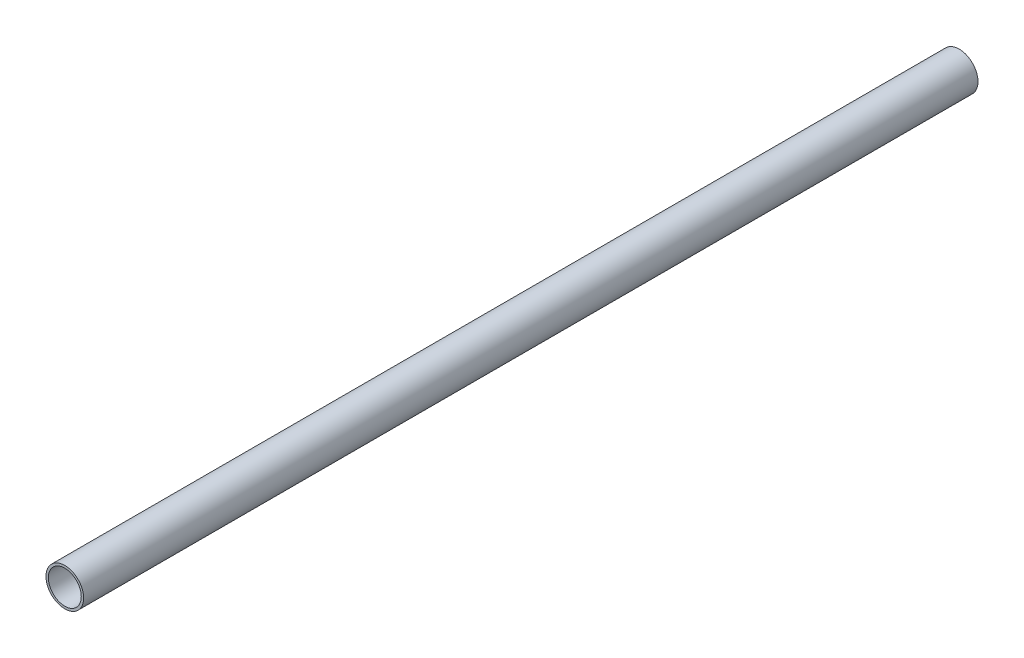
ISO-10303-21;
HEADER;
FILE_DESCRIPTION(('STEP AP214'),'2;1');
FILE_NAME('part.step','',(''),(''),'','','');
FILE_SCHEMA(('AUTOMOTIVE_DESIGN { 1 0 10303 214 1 1 1 1 }'));
ENDSEC;
DATA;
#1=APPLICATION_CONTEXT('core data for automotive mechanical design processes');
#2=APPLICATION_PROTOCOL_DEFINITION('international standard','automotive_design',2000,#1);
#3=PRODUCT_CONTEXT('',#1,'mechanical');
#4=PRODUCT('Part','Part','',(#3));
#5=PRODUCT_RELATED_PRODUCT_CATEGORY('part','',(#4));
#6=PRODUCT_DEFINITION_FORMATION('','',#4);
#7=PRODUCT_DEFINITION_CONTEXT('part definition',#1,'design');
#8=PRODUCT_DEFINITION('design','',#6,#7);
#9=PRODUCT_DEFINITION_SHAPE('','',#8);
#10=(LENGTH_UNIT() NAMED_UNIT(*) SI_UNIT(.MILLI.,.METRE.));
#11=(NAMED_UNIT(*) PLANE_ANGLE_UNIT() SI_UNIT($,.RADIAN.));
#12=(NAMED_UNIT(*) SI_UNIT($,.STERADIAN.) SOLID_ANGLE_UNIT());
#13=UNCERTAINTY_MEASURE_WITH_UNIT(LENGTH_MEASURE(1.E-05),#10,'distance_accuracy_value','');
#14=(GEOMETRIC_REPRESENTATION_CONTEXT(3) GLOBAL_UNCERTAINTY_ASSIGNED_CONTEXT((#13)) GLOBAL_UNIT_ASSIGNED_CONTEXT((#10,
#11,#12)) REPRESENTATION_CONTEXT('',''));
#15=CARTESIAN_POINT('',(0.,0.,0.));
#16=DIRECTION('',(0.,0.,1.));
#17=DIRECTION('',(1.,0.,0.));
#18=AXIS2_PLACEMENT_3D('',#15,#16,#17);
#19=CARTESIAN_POINT('',(0.,0.,380.));
#20=DIRECTION('',(0.,0.,1.));
#21=DIRECTION('',(1.,0.,0.));
#22=AXIS2_PLACEMENT_3D('',#19,#20,#21);
#23=PLANE('',#22);
#24=CARTESIAN_POINT('',(0.,0.,380.));
#25=DIRECTION('',(0.,0.,1.));
#26=DIRECTION('',(1.,0.,0.));
#27=AXIS2_PLACEMENT_3D('',#24,#25,#26);
#28=CIRCLE('',#27,8.);
#29=CARTESIAN_POINT('',(8.,0.,380.));
#30=VERTEX_POINT('',#29);
#31=EDGE_CURVE('E10',#30,#30,#28,.T.);
#32=ORIENTED_EDGE('',*,*,#31,.T.);
#33=EDGE_LOOP('',(#32));
#34=FACE_BOUND('',#33,.T.);
#35=CARTESIAN_POINT('',(0.,0.,380.));
#36=DIRECTION('',(0.,0.,1.));
#37=DIRECTION('',(1.,0.,0.));
#38=AXIS2_PLACEMENT_3D('',#35,#36,#37);
#39=CIRCLE('',#38,7.);
#40=CARTESIAN_POINT('',(7.,0.,380.));
#41=VERTEX_POINT('',#40);
#42=EDGE_CURVE('E41',#41,#41,#39,.T.);
#43=ORIENTED_EDGE('',*,*,#42,.F.);
#44=EDGE_LOOP('',(#43));
#45=FACE_BOUND('',#44,.T.);
#46=ADVANCED_FACE('F30',(#34,#45),#23,.T.);
#47=CARTESIAN_POINT('',(0.,0.,0.));
#48=DIRECTION('',(0.,0.,1.));
#49=DIRECTION('',(1.,0.,0.));
#50=AXIS2_PLACEMENT_3D('',#47,#48,#49);
#51=PLANE('',#50);
#52=CARTESIAN_POINT('',(0.,0.,0.));
#53=DIRECTION('',(0.,0.,1.));
#54=DIRECTION('',(1.,0.,0.));
#55=AXIS2_PLACEMENT_3D('',#52,#53,#54);
#56=CIRCLE('',#55,8.);
#57=CARTESIAN_POINT('',(8.,0.,0.));
#58=VERTEX_POINT('',#57);
#59=EDGE_CURVE('E34',#58,#58,#56,.T.);
#60=ORIENTED_EDGE('',*,*,#59,.F.);
#61=EDGE_LOOP('',(#60));
#62=FACE_BOUND('',#61,.T.);
#63=CARTESIAN_POINT('',(0.,0.,0.));
#64=DIRECTION('',(0.,0.,1.));
#65=DIRECTION('',(1.,0.,0.));
#66=AXIS2_PLACEMENT_3D('',#63,#64,#65);
#67=CIRCLE('',#66,7.);
#68=CARTESIAN_POINT('',(7.,0.,0.));
#69=VERTEX_POINT('',#68);
#70=EDGE_CURVE('E43',#69,#69,#67,.T.);
#71=ORIENTED_EDGE('',*,*,#70,.T.);
#72=EDGE_LOOP('',(#71));
#73=FACE_BOUND('',#72,.T.);
#74=ADVANCED_FACE('F53',(#62,#73),#51,.F.);
#75=CARTESIAN_POINT('',(0.,0.,380.));
#76=DIRECTION('',(0.,0.,-1.));
#77=DIRECTION('',(-1.,0.,0.));
#78=AXIS2_PLACEMENT_3D('',#75,#76,#77);
#79=CYLINDRICAL_SURFACE('',#78,8.);
#80=ORIENTED_EDGE('',*,*,#31,.F.);
#81=EDGE_LOOP('',(#80));
#82=FACE_BOUND('',#81,.T.);
#83=ORIENTED_EDGE('',*,*,#59,.T.);
#84=EDGE_LOOP('',(#83));
#85=FACE_BOUND('',#84,.T.);
#86=ADVANCED_FACE('F32',(#82,#85),#79,.T.);
#87=CARTESIAN_POINT('',(0.,0.,380.));
#88=DIRECTION('',(0.,0.,-1.));
#89=DIRECTION('',(-1.,0.,0.));
#90=AXIS2_PLACEMENT_3D('',#87,#88,#89);
#91=CYLINDRICAL_SURFACE('',#90,7.);
#92=ORIENTED_EDGE('',*,*,#42,.T.);
#93=EDGE_LOOP('',(#92));
#94=FACE_BOUND('',#93,.T.);
#95=ORIENTED_EDGE('',*,*,#70,.F.);
#96=EDGE_LOOP('',(#95));
#97=FACE_BOUND('',#96,.T.);
#98=ADVANCED_FACE('F49',(#94,#97),#91,.F.);
#99=CLOSED_SHELL('',(#46,#74,#86,#98));
#100=MANIFOLD_SOLID_BREP('B2',#99);
#101=ADVANCED_BREP_SHAPE_REPRESENTATION('',(#18,#100),#14);
#102=SHAPE_DEFINITION_REPRESENTATION(#9,#101);
ENDSEC;
END-ISO-10303-21;
